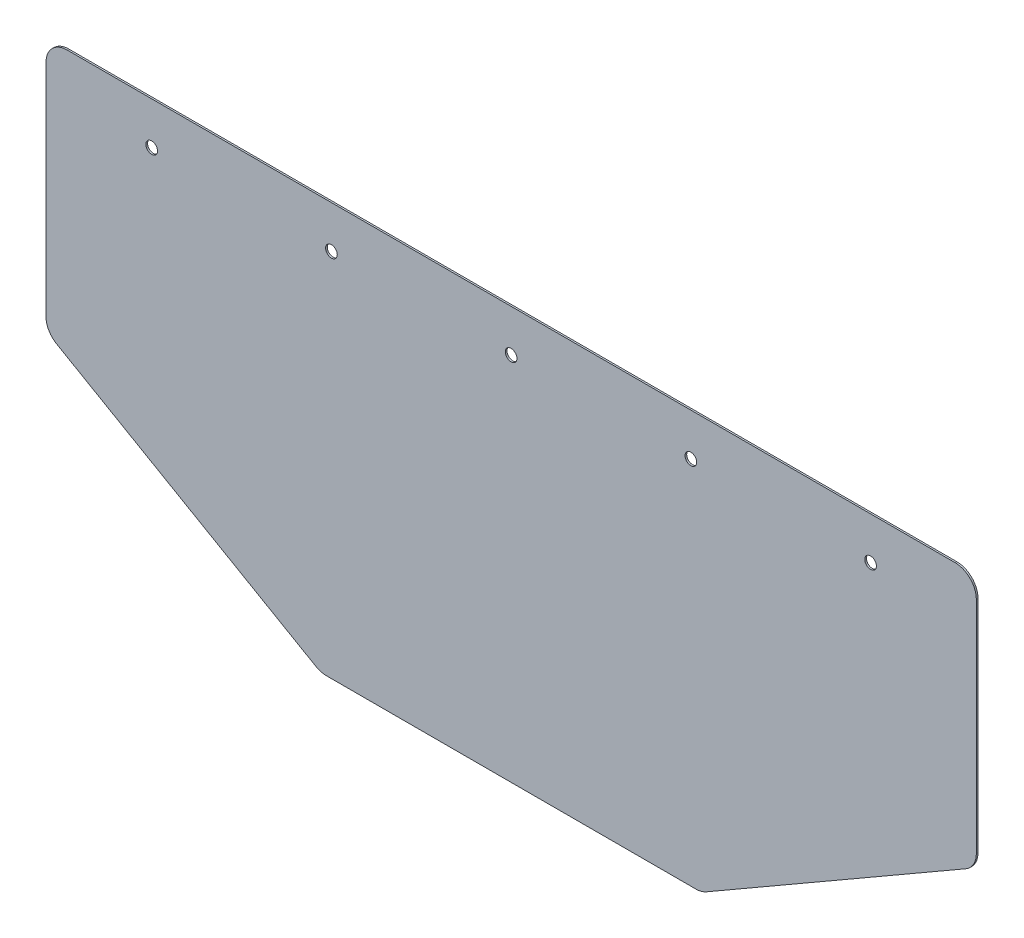
ISO-10303-21;
HEADER;
FILE_DESCRIPTION(('STEP AP214'),'2;1');
FILE_NAME('part.step','',(''),(''),'','','');
FILE_SCHEMA(('AUTOMOTIVE_DESIGN { 1 0 10303 214 1 1 1 1 }'));
ENDSEC;
DATA;
#1=APPLICATION_CONTEXT('core data for automotive mechanical design processes');
#2=APPLICATION_PROTOCOL_DEFINITION('international standard','automotive_design',2000,#1);
#3=PRODUCT_CONTEXT('',#1,'mechanical');
#4=PRODUCT('Part','Part','',(#3));
#5=PRODUCT_RELATED_PRODUCT_CATEGORY('part','',(#4));
#6=PRODUCT_DEFINITION_FORMATION('','',#4);
#7=PRODUCT_DEFINITION_CONTEXT('part definition',#1,'design');
#8=PRODUCT_DEFINITION('design','',#6,#7);
#9=PRODUCT_DEFINITION_SHAPE('','',#8);
#10=(LENGTH_UNIT() NAMED_UNIT(*) SI_UNIT(.MILLI.,.METRE.));
#11=(NAMED_UNIT(*) PLANE_ANGLE_UNIT() SI_UNIT($,.RADIAN.));
#12=(NAMED_UNIT(*) SI_UNIT($,.STERADIAN.) SOLID_ANGLE_UNIT());
#13=UNCERTAINTY_MEASURE_WITH_UNIT(LENGTH_MEASURE(1.E-05),#10,'distance_accuracy_value','');
#14=(GEOMETRIC_REPRESENTATION_CONTEXT(3) GLOBAL_UNCERTAINTY_ASSIGNED_CONTEXT((#13)) GLOBAL_UNIT_ASSIGNED_CONTEXT((#10,
#11,#12)) REPRESENTATION_CONTEXT('',''));
#15=CARTESIAN_POINT('',(0.,0.,0.));
#16=DIRECTION('',(0.,0.,1.));
#17=DIRECTION('',(1.,0.,0.));
#18=AXIS2_PLACEMENT_3D('',#15,#16,#17);
#19=CARTESIAN_POINT('',(-260.479399237396,-29.5340725077158,1.016));
#20=DIRECTION('',(0.,0.,1.));
#21=DIRECTION('',(1.,0.,0.));
#22=AXIS2_PLACEMENT_3D('',#19,#20,#21);
#23=PLANE('',#22);
#24=CARTESIAN_POINT('',(114.170600762604,90.1308656498606,1.016));
#25=DIRECTION('',(0.,0.,1.));
#26=DIRECTION('',(1.,0.,0.));
#27=AXIS2_PLACEMENT_3D('',#24,#25,#26);
#28=CIRCLE('',#27,3.50000000000001);
#29=CARTESIAN_POINT('',(117.670600762604,90.1308656498606,1.016));
#30=VERTEX_POINT('',#29);
#31=EDGE_CURVE('E455',#30,#30,#28,.T.);
#32=ORIENTED_EDGE('',*,*,#31,.F.);
#33=EDGE_LOOP('',(#32));
#34=FACE_BOUND('',#33,.T.);
#35=CARTESIAN_POINT('',(-101.729399237396,90.1308656498606,1.016));
#36=DIRECTION('',(0.,0.,1.));
#37=DIRECTION('',(1.,0.,0.));
#38=AXIS2_PLACEMENT_3D('',#35,#36,#37);
#39=CIRCLE('',#38,3.50000000000001);
#40=CARTESIAN_POINT('',(-98.2293992373955,90.1308656498606,1.016));
#41=VERTEX_POINT('',#40);
#42=EDGE_CURVE('E467',#41,#41,#39,.T.);
#43=ORIENTED_EDGE('',*,*,#42,.F.);
#44=EDGE_LOOP('',(#43));
#45=FACE_BOUND('',#44,.T.);
#46=DIRECTION('',(0.,1.,0.));
#47=VECTOR('',#46,1.);
#48=CARTESIAN_POINT('',(285.620600762604,115.530865649861,1.016));
#49=LINE('',#48,#47);
#50=CARTESIAN_POINT('',(285.620600762604,-29.5340725077158,1.016));
#51=VERTEX_POINT('',#50);
#52=CARTESIAN_POINT('',(285.620600762604,102.830865649861,1.016));
#53=VERTEX_POINT('',#52);
#54=EDGE_CURVE('E177',#51,#53,#49,.T.);
#55=ORIENTED_EDGE('',*,*,#54,.T.);
#56=CARTESIAN_POINT('',(272.920600762604,102.830865649861,1.016));
#57=DIRECTION('',(0.,0.,1.));
#58=DIRECTION('',(1.,0.,0.));
#59=AXIS2_PLACEMENT_3D('',#56,#57,#58);
#60=CIRCLE('',#59,12.7);
#61=CARTESIAN_POINT('',(272.920600762604,115.530865649861,1.016));
#62=VERTEX_POINT('',#61);
#63=EDGE_CURVE('E47',#53,#62,#60,.T.);
#64=ORIENTED_EDGE('',*,*,#63,.T.);
#65=DIRECTION('',(-1.,0.,0.));
#66=VECTOR('',#65,1.);
#67=CARTESIAN_POINT('',(285.620600762604,115.530865649861,1.016));
#68=LINE('',#67,#66);
#69=CARTESIAN_POINT('',(-260.479399237396,115.530865649861,1.016));
#70=VERTEX_POINT('',#69);
#71=EDGE_CURVE('E176',#62,#70,#68,.T.);
#72=ORIENTED_EDGE('',*,*,#71,.T.);
#73=CARTESIAN_POINT('',(-260.479399237396,102.830865649861,1.016));
#74=DIRECTION('',(0.,0.,1.));
#75=DIRECTION('',(1.,0.,0.));
#76=AXIS2_PLACEMENT_3D('',#73,#74,#75);
#77=CIRCLE('',#76,12.7);
#78=CARTESIAN_POINT('',(-273.179399237396,102.830865649861,1.016));
#79=VERTEX_POINT('',#78);
#80=EDGE_CURVE('E54',#70,#79,#77,.T.);
#81=ORIENTED_EDGE('',*,*,#80,.T.);
#82=DIRECTION('',(0.,-1.,0.));
#83=VECTOR('',#82,1.);
#84=CARTESIAN_POINT('',(-273.179399237396,115.530865649861,1.016));
#85=LINE('',#84,#83);
#86=CARTESIAN_POINT('',(-273.179399237396,-29.5340725077158,1.016));
#87=VERTEX_POINT('',#86);
#88=EDGE_CURVE('E132',#79,#87,#85,.T.);
#89=ORIENTED_EDGE('',*,*,#88,.T.);
#90=CARTESIAN_POINT('',(-260.479399237396,-29.5340725077158,1.016));
#91=DIRECTION('',(0.,0.,1.));
#92=DIRECTION('',(1.,0.,0.));
#93=AXIS2_PLACEMENT_3D('',#90,#91,#92);
#94=CIRCLE('',#93,12.7);
#95=CARTESIAN_POINT('',(-266.825874396713,-40.534629450533,1.016));
#96=VERTEX_POINT('',#95);
#97=EDGE_CURVE('E135',#87,#96,#94,.T.);
#98=ORIENTED_EDGE('',*,*,#97,.T.);
#99=DIRECTION('',(0.866185586048601,-0.499722453489577,0.));
#100=VECTOR('',#99,1.);
#101=CARTESIAN_POINT('',(-266.825874396713,-40.534629450533,1.016));
#102=LINE('',#101,#100);
#103=CARTESIAN_POINT('',(-111.025100536512,-130.419691292956,1.016));
#104=VERTEX_POINT('',#103);
#105=EDGE_CURVE('E149',#96,#104,#102,.T.);
#106=ORIENTED_EDGE('',*,*,#105,.T.);
#107=CARTESIAN_POINT('',(-104.678625377195,-119.419134350139,1.016));
#108=DIRECTION('',(0.,0.,1.));
#109=DIRECTION('',(-1.,0.,0.));
#110=AXIS2_PLACEMENT_3D('',#107,#108,#109);
#111=CIRCLE('',#110,12.7);
#112=CARTESIAN_POINT('',(-104.678625377195,-132.119134350139,1.016));
#113=VERTEX_POINT('',#112);
#114=EDGE_CURVE('E229',#104,#113,#111,.T.);
#115=ORIENTED_EDGE('',*,*,#114,.T.);
#116=DIRECTION('',(1.,0.,0.));
#117=VECTOR('',#116,1.);
#118=CARTESIAN_POINT('',(6.2206007626045,-132.119134350139,1.016));
#119=LINE('',#118,#117);
#120=CARTESIAN_POINT('',(117.119826902404,-132.119134350139,1.016));
#121=VERTEX_POINT('',#120);
#122=EDGE_CURVE('E263',#113,#121,#119,.T.);
#123=ORIENTED_EDGE('',*,*,#122,.T.);
#124=CARTESIAN_POINT('',(117.119826902404,-119.419134350139,1.016));
#125=DIRECTION('',(0.,0.,1.));
#126=DIRECTION('',(-1.,0.,0.));
#127=AXIS2_PLACEMENT_3D('',#124,#125,#126);
#128=CIRCLE('',#127,12.7);
#129=CARTESIAN_POINT('',(123.466302061721,-130.419691292957,1.016));
#130=VERTEX_POINT('',#129);
#131=EDGE_CURVE('E256',#121,#130,#128,.T.);
#132=ORIENTED_EDGE('',*,*,#131,.T.);
#133=DIRECTION('',(0.866185586048601,0.499722453489577,0.));
#134=VECTOR('',#133,1.);
#135=CARTESIAN_POINT('',(279.267075921922,-40.534629450533,1.016));
#136=LINE('',#135,#134);
#137=CARTESIAN_POINT('',(279.267075921922,-40.5346294505329,1.016));
#138=VERTEX_POINT('',#137);
#139=EDGE_CURVE('E252',#130,#138,#136,.T.);
#140=ORIENTED_EDGE('',*,*,#139,.T.);
#141=CARTESIAN_POINT('',(272.920600762604,-29.5340725077158,1.016));
#142=DIRECTION('',(0.,0.,1.));
#143=DIRECTION('',(-1.,0.,0.));
#144=AXIS2_PLACEMENT_3D('',#141,#142,#143);
#145=CIRCLE('',#144,12.7);
#146=EDGE_CURVE('E251',#138,#51,#145,.T.);
#147=ORIENTED_EDGE('',*,*,#146,.T.);
#148=EDGE_LOOP('',(#55,#64,#72,#81,#89,#98,#106,#115,#123,#132,#140,#147));
#149=FACE_BOUND('',#148,.T.);
#150=CARTESIAN_POINT('',(-209.679399237396,90.1308656498606,1.016));
#151=DIRECTION('',(0.,0.,1.));
#152=DIRECTION('',(1.,0.,0.));
#153=AXIS2_PLACEMENT_3D('',#150,#151,#152);
#154=CIRCLE('',#153,3.49999999999999);
#155=CARTESIAN_POINT('',(-206.179399237396,90.1308656498606,1.016));
#156=VERTEX_POINT('',#155);
#157=EDGE_CURVE('E260',#156,#156,#154,.T.);
#158=ORIENTED_EDGE('',*,*,#157,.F.);
#159=EDGE_LOOP('',(#158));
#160=FACE_BOUND('',#159,.T.);
#161=CARTESIAN_POINT('',(6.2206007626045,90.1308656498606,1.016));
#162=DIRECTION('',(0.,0.,1.));
#163=DIRECTION('',(1.,0.,0.));
#164=AXIS2_PLACEMENT_3D('',#161,#162,#163);
#165=CIRCLE('',#164,3.5);
#166=CARTESIAN_POINT('',(9.7206007626045,90.1308656498606,1.016));
#167=VERTEX_POINT('',#166);
#168=EDGE_CURVE('E461',#167,#167,#165,.T.);
#169=ORIENTED_EDGE('',*,*,#168,.F.);
#170=EDGE_LOOP('',(#169));
#171=FACE_BOUND('',#170,.T.);
#172=CARTESIAN_POINT('',(222.120600762604,90.1308656498606,1.016));
#173=DIRECTION('',(0.,0.,1.));
#174=DIRECTION('',(1.,0.,0.));
#175=AXIS2_PLACEMENT_3D('',#172,#173,#174);
#176=CIRCLE('',#175,3.49999999999999);
#177=CARTESIAN_POINT('',(225.620600762604,90.1308656498606,1.016));
#178=VERTEX_POINT('',#177);
#179=EDGE_CURVE('E445',#178,#178,#176,.T.);
#180=ORIENTED_EDGE('',*,*,#179,.F.);
#181=EDGE_LOOP('',(#180));
#182=FACE_BOUND('',#181,.T.);
#183=ADVANCED_FACE('F39',(#34,#45,#149,#160,#171,#182),#23,.T.);
#184=CARTESIAN_POINT('',(-260.479399237396,-29.5340725077158,0.));
#185=DIRECTION('',(0.,0.,1.));
#186=DIRECTION('',(1.,0.,0.));
#187=AXIS2_PLACEMENT_3D('',#184,#185,#186);
#188=PLANE('',#187);
#189=DIRECTION('',(-1.,0.,0.));
#190=VECTOR('',#189,1.);
#191=CARTESIAN_POINT('',(285.620600762604,115.530865649861,0.));
#192=LINE('',#191,#190);
#193=CARTESIAN_POINT('',(272.920600762604,115.530865649861,0.));
#194=VERTEX_POINT('',#193);
#195=CARTESIAN_POINT('',(-260.479399237396,115.530865649861,0.));
#196=VERTEX_POINT('',#195);
#197=EDGE_CURVE('E140',#194,#196,#192,.T.);
#198=ORIENTED_EDGE('',*,*,#197,.F.);
#199=CARTESIAN_POINT('',(272.920600762604,102.830865649861,0.));
#200=DIRECTION('',(0.,0.,1.));
#201=DIRECTION('',(1.,0.,0.));
#202=AXIS2_PLACEMENT_3D('',#199,#200,#201);
#203=CIRCLE('',#202,12.7);
#204=CARTESIAN_POINT('',(285.620600762604,102.830865649861,0.));
#205=VERTEX_POINT('',#204);
#206=EDGE_CURVE('E168',#194,#205,#203,.F.);
#207=ORIENTED_EDGE('',*,*,#206,.T.);
#208=DIRECTION('',(0.,1.,0.));
#209=VECTOR('',#208,1.);
#210=CARTESIAN_POINT('',(285.620600762604,115.530865649861,0.));
#211=LINE('',#210,#209);
#212=CARTESIAN_POINT('',(285.620600762604,-29.5340725077158,0.));
#213=VERTEX_POINT('',#212);
#214=EDGE_CURVE('E194',#213,#205,#211,.T.);
#215=ORIENTED_EDGE('',*,*,#214,.F.);
#216=CARTESIAN_POINT('',(272.920600762604,-29.5340725077158,0.));
#217=DIRECTION('',(0.,0.,1.));
#218=DIRECTION('',(-1.,0.,0.));
#219=AXIS2_PLACEMENT_3D('',#216,#217,#218);
#220=CIRCLE('',#219,12.7);
#221=CARTESIAN_POINT('',(279.267075921922,-40.5346294505329,0.));
#222=VERTEX_POINT('',#221);
#223=EDGE_CURVE('E199',#222,#213,#220,.T.);
#224=ORIENTED_EDGE('',*,*,#223,.F.);
#225=DIRECTION('',(0.866185586048601,0.499722453489577,0.));
#226=VECTOR('',#225,1.);
#227=CARTESIAN_POINT('',(279.267075921922,-40.534629450533,0.));
#228=LINE('',#227,#226);
#229=CARTESIAN_POINT('',(123.466302061721,-130.419691292957,0.));
#230=VERTEX_POINT('',#229);
#231=EDGE_CURVE('E204',#230,#222,#228,.T.);
#232=ORIENTED_EDGE('',*,*,#231,.F.);
#233=CARTESIAN_POINT('',(117.119826902404,-119.419134350139,0.));
#234=DIRECTION('',(0.,0.,1.));
#235=DIRECTION('',(-1.,0.,0.));
#236=AXIS2_PLACEMENT_3D('',#233,#234,#235);
#237=CIRCLE('',#236,12.7);
#238=CARTESIAN_POINT('',(117.119826902404,-132.119134350139,0.));
#239=VERTEX_POINT('',#238);
#240=EDGE_CURVE('E236',#239,#230,#237,.T.);
#241=ORIENTED_EDGE('',*,*,#240,.F.);
#242=DIRECTION('',(1.,0.,0.));
#243=VECTOR('',#242,1.);
#244=CARTESIAN_POINT('',(6.2206007626045,-132.119134350139,0.));
#245=LINE('',#244,#243);
#246=CARTESIAN_POINT('',(-104.678625377195,-132.119134350139,0.));
#247=VERTEX_POINT('',#246);
#248=EDGE_CURVE('E234',#247,#239,#245,.T.);
#249=ORIENTED_EDGE('',*,*,#248,.F.);
#250=CARTESIAN_POINT('',(-104.678625377195,-119.419134350139,0.));
#251=DIRECTION('',(0.,0.,1.));
#252=DIRECTION('',(-1.,0.,0.));
#253=AXIS2_PLACEMENT_3D('',#250,#251,#252);
#254=CIRCLE('',#253,12.7);
#255=CARTESIAN_POINT('',(-111.025100536512,-130.419691292956,0.));
#256=VERTEX_POINT('',#255);
#257=EDGE_CURVE('E228',#256,#247,#254,.T.);
#258=ORIENTED_EDGE('',*,*,#257,.F.);
#259=DIRECTION('',(0.866185586048601,-0.499722453489577,0.));
#260=VECTOR('',#259,1.);
#261=CARTESIAN_POINT('',(-266.825874396713,-40.534629450533,0.));
#262=LINE('',#261,#260);
#263=CARTESIAN_POINT('',(-266.825874396713,-40.534629450533,0.));
#264=VERTEX_POINT('',#263);
#265=EDGE_CURVE('E232',#264,#256,#262,.T.);
#266=ORIENTED_EDGE('',*,*,#265,.F.);
#267=CARTESIAN_POINT('',(-260.479399237396,-29.5340725077158,0.));
#268=DIRECTION('',(0.,0.,1.));
#269=DIRECTION('',(1.,0.,0.));
#270=AXIS2_PLACEMENT_3D('',#267,#268,#269);
#271=CIRCLE('',#270,12.7);
#272=CARTESIAN_POINT('',(-273.179399237396,-29.5340725077158,0.));
#273=VERTEX_POINT('',#272);
#274=EDGE_CURVE('E238',#273,#264,#271,.T.);
#275=ORIENTED_EDGE('',*,*,#274,.F.);
#276=DIRECTION('',(0.,-1.,0.));
#277=VECTOR('',#276,1.);
#278=CARTESIAN_POINT('',(-273.179399237396,115.530865649861,0.));
#279=LINE('',#278,#277);
#280=CARTESIAN_POINT('',(-273.179399237396,102.830865649861,0.));
#281=VERTEX_POINT('',#280);
#282=EDGE_CURVE('E153',#281,#273,#279,.T.);
#283=ORIENTED_EDGE('',*,*,#282,.F.);
#284=CARTESIAN_POINT('',(-260.479399237396,102.830865649861,0.));
#285=DIRECTION('',(0.,0.,1.));
#286=DIRECTION('',(1.,0.,0.));
#287=AXIS2_PLACEMENT_3D('',#284,#285,#286);
#288=CIRCLE('',#287,12.7);
#289=EDGE_CURVE('E166',#281,#196,#288,.F.);
#290=ORIENTED_EDGE('',*,*,#289,.T.);
#291=EDGE_LOOP('',(#198,#207,#215,#224,#232,#241,#249,#258,#266,#275,#283,#290));
#292=FACE_BOUND('',#291,.T.);
#293=CARTESIAN_POINT('',(-209.679399237396,90.1308656498606,0.));
#294=DIRECTION('',(0.,0.,1.));
#295=DIRECTION('',(1.,0.,0.));
#296=AXIS2_PLACEMENT_3D('',#293,#294,#295);
#297=CIRCLE('',#296,3.49999999999999);
#298=CARTESIAN_POINT('',(-206.179399237396,90.1308656498606,0.));
#299=VERTEX_POINT('',#298);
#300=EDGE_CURVE('E470',#299,#299,#297,.T.);
#301=ORIENTED_EDGE('',*,*,#300,.T.);
#302=EDGE_LOOP('',(#301));
#303=FACE_BOUND('',#302,.T.);
#304=CARTESIAN_POINT('',(-101.729399237396,90.1308656498606,0.));
#305=DIRECTION('',(0.,0.,1.));
#306=DIRECTION('',(1.,0.,0.));
#307=AXIS2_PLACEMENT_3D('',#304,#305,#306);
#308=CIRCLE('',#307,3.50000000000001);
#309=CARTESIAN_POINT('',(-98.2293992373955,90.1308656498606,0.));
#310=VERTEX_POINT('',#309);
#311=EDGE_CURVE('E464',#310,#310,#308,.T.);
#312=ORIENTED_EDGE('',*,*,#311,.T.);
#313=EDGE_LOOP('',(#312));
#314=FACE_BOUND('',#313,.T.);
#315=CARTESIAN_POINT('',(6.2206007626045,90.1308656498606,0.));
#316=DIRECTION('',(0.,0.,1.));
#317=DIRECTION('',(1.,0.,0.));
#318=AXIS2_PLACEMENT_3D('',#315,#316,#317);
#319=CIRCLE('',#318,3.5);
#320=CARTESIAN_POINT('',(9.7206007626045,90.1308656498606,0.));
#321=VERTEX_POINT('',#320);
#322=EDGE_CURVE('E458',#321,#321,#319,.T.);
#323=ORIENTED_EDGE('',*,*,#322,.T.);
#324=EDGE_LOOP('',(#323));
#325=FACE_BOUND('',#324,.T.);
#326=CARTESIAN_POINT('',(114.170600762604,90.1308656498606,0.));
#327=DIRECTION('',(0.,0.,1.));
#328=DIRECTION('',(1.,0.,0.));
#329=AXIS2_PLACEMENT_3D('',#326,#327,#328);
#330=CIRCLE('',#329,3.50000000000001);
#331=CARTESIAN_POINT('',(117.670600762604,90.1308656498606,0.));
#332=VERTEX_POINT('',#331);
#333=EDGE_CURVE('E452',#332,#332,#330,.T.);
#334=ORIENTED_EDGE('',*,*,#333,.T.);
#335=EDGE_LOOP('',(#334));
#336=FACE_BOUND('',#335,.T.);
#337=CARTESIAN_POINT('',(222.120600762604,90.1308656498606,0.));
#338=DIRECTION('',(0.,0.,1.));
#339=DIRECTION('',(1.,0.,0.));
#340=AXIS2_PLACEMENT_3D('',#337,#338,#339);
#341=CIRCLE('',#340,3.49999999999999);
#342=CARTESIAN_POINT('',(225.620600762604,90.1308656498606,0.));
#343=VERTEX_POINT('',#342);
#344=EDGE_CURVE('E448',#343,#343,#341,.T.);
#345=ORIENTED_EDGE('',*,*,#344,.T.);
#346=EDGE_LOOP('',(#345));
#347=FACE_BOUND('',#346,.T.);
#348=ADVANCED_FACE('F191',(#292,#303,#314,#325,#336,#347),#188,.F.);
#349=CARTESIAN_POINT('',(-273.179399237396,115.530865649861,1.016));
#350=DIRECTION('',(1.,0.,0.));
#351=DIRECTION('',(0.,0.,-1.));
#352=AXIS2_PLACEMENT_3D('',#349,#350,#351);
#353=PLANE('',#352);
#354=ORIENTED_EDGE('',*,*,#88,.F.);
#355=DIRECTION('',(0.,0.,-1.));
#356=VECTOR('',#355,1.);
#357=CARTESIAN_POINT('',(-273.179399237396,102.830865649861,1.016));
#358=LINE('',#357,#356);
#359=EDGE_CURVE('E11',#79,#281,#358,.T.);
#360=ORIENTED_EDGE('',*,*,#359,.T.);
#361=ORIENTED_EDGE('',*,*,#282,.T.);
#362=DIRECTION('',(0.,0.,-1.));
#363=VECTOR('',#362,1.);
#364=CARTESIAN_POINT('',(-273.179399237396,-29.5340725077158,1.016));
#365=LINE('',#364,#363);
#366=EDGE_CURVE('E145',#87,#273,#365,.T.);
#367=ORIENTED_EDGE('',*,*,#366,.F.);
#368=EDGE_LOOP('',(#354,#360,#361,#367));
#369=FACE_BOUND('',#368,.T.);
#370=ADVANCED_FACE('F151',(#369),#353,.F.);
#371=CARTESIAN_POINT('',(-260.479399237396,-29.5340725077158,1.016));
#372=DIRECTION('',(0.,0.,-1.));
#373=DIRECTION('',(-1.,0.,0.));
#374=AXIS2_PLACEMENT_3D('',#371,#372,#373);
#375=CYLINDRICAL_SURFACE('',#374,12.7);
#376=ORIENTED_EDGE('',*,*,#274,.T.);
#377=DIRECTION('',(0.,0.,-1.));
#378=VECTOR('',#377,1.);
#379=CARTESIAN_POINT('',(-266.825874396713,-40.534629450533,1.016));
#380=LINE('',#379,#378);
#381=EDGE_CURVE('E147',#96,#264,#380,.T.);
#382=ORIENTED_EDGE('',*,*,#381,.F.);
#383=ORIENTED_EDGE('',*,*,#97,.F.);
#384=ORIENTED_EDGE('',*,*,#366,.T.);
#385=EDGE_LOOP('',(#376,#382,#383,#384));
#386=FACE_BOUND('',#385,.T.);
#387=ADVANCED_FACE('F144',(#386),#375,.T.);
#388=CARTESIAN_POINT('',(-266.825874396713,-40.534629450533,1.016));
#389=DIRECTION('',(0.499722453489577,0.866185586048601,0.));
#390=DIRECTION('',(-0.866185586048601,0.499722453489577,0.));
#391=AXIS2_PLACEMENT_3D('',#388,#389,#390);
#392=PLANE('',#391);
#393=ORIENTED_EDGE('',*,*,#265,.T.);
#394=DIRECTION('',(0.,0.,-1.));
#395=VECTOR('',#394,1.);
#396=CARTESIAN_POINT('',(-111.025100536512,-130.419691292956,1.016));
#397=LINE('',#396,#395);
#398=EDGE_CURVE('E159',#104,#256,#397,.T.);
#399=ORIENTED_EDGE('',*,*,#398,.F.);
#400=ORIENTED_EDGE('',*,*,#105,.F.);
#401=ORIENTED_EDGE('',*,*,#381,.T.);
#402=EDGE_LOOP('',(#393,#399,#400,#401));
#403=FACE_BOUND('',#402,.T.);
#404=ADVANCED_FACE('F261',(#403),#392,.F.);
#405=CARTESIAN_POINT('',(-104.678625377195,-119.419134350139,1.016));
#406=DIRECTION('',(0.,0.,-1.));
#407=DIRECTION('',(-1.,0.,0.));
#408=AXIS2_PLACEMENT_3D('',#405,#406,#407);
#409=CYLINDRICAL_SURFACE('',#408,12.7);
#410=ORIENTED_EDGE('',*,*,#257,.T.);
#411=DIRECTION('',(0.,0.,-1.));
#412=VECTOR('',#411,1.);
#413=CARTESIAN_POINT('',(-104.678625377195,-132.119134350139,1.016));
#414=LINE('',#413,#412);
#415=EDGE_CURVE('E218',#113,#247,#414,.T.);
#416=ORIENTED_EDGE('',*,*,#415,.F.);
#417=ORIENTED_EDGE('',*,*,#114,.F.);
#418=ORIENTED_EDGE('',*,*,#398,.T.);
#419=EDGE_LOOP('',(#410,#416,#417,#418));
#420=FACE_BOUND('',#419,.T.);
#421=ADVANCED_FACE('F226',(#420),#409,.T.);
#422=CARTESIAN_POINT('',(6.2206007626045,-132.119134350139,1.016));
#423=DIRECTION('',(0.,1.,0.));
#424=DIRECTION('',(-1.,0.,0.));
#425=AXIS2_PLACEMENT_3D('',#422,#423,#424);
#426=PLANE('',#425);
#427=ORIENTED_EDGE('',*,*,#248,.T.);
#428=DIRECTION('',(0.,0.,-1.));
#429=VECTOR('',#428,1.);
#430=CARTESIAN_POINT('',(117.119826902404,-132.119134350139,1.016));
#431=LINE('',#430,#429);
#432=EDGE_CURVE('E215',#121,#239,#431,.T.);
#433=ORIENTED_EDGE('',*,*,#432,.F.);
#434=ORIENTED_EDGE('',*,*,#122,.F.);
#435=ORIENTED_EDGE('',*,*,#415,.T.);
#436=EDGE_LOOP('',(#427,#433,#434,#435));
#437=FACE_BOUND('',#436,.T.);
#438=ADVANCED_FACE('F272',(#437),#426,.F.);
#439=CARTESIAN_POINT('',(117.119826902404,-119.419134350139,1.016));
#440=DIRECTION('',(0.,0.,-1.));
#441=DIRECTION('',(-1.,0.,0.));
#442=AXIS2_PLACEMENT_3D('',#439,#440,#441);
#443=CYLINDRICAL_SURFACE('',#442,12.7);
#444=ORIENTED_EDGE('',*,*,#240,.T.);
#445=DIRECTION('',(0.,0.,-1.));
#446=VECTOR('',#445,1.);
#447=CARTESIAN_POINT('',(123.466302061721,-130.419691292957,1.016));
#448=LINE('',#447,#446);
#449=EDGE_CURVE('E212',#130,#230,#448,.T.);
#450=ORIENTED_EDGE('',*,*,#449,.F.);
#451=ORIENTED_EDGE('',*,*,#131,.F.);
#452=ORIENTED_EDGE('',*,*,#432,.T.);
#453=EDGE_LOOP('',(#444,#450,#451,#452));
#454=FACE_BOUND('',#453,.T.);
#455=ADVANCED_FACE('F270',(#454),#443,.T.);
#456=CARTESIAN_POINT('',(279.267075921922,-40.534629450533,1.016));
#457=DIRECTION('',(-0.499722453489577,0.866185586048601,0.));
#458=DIRECTION('',(-0.866185586048601,-0.499722453489577,0.));
#459=AXIS2_PLACEMENT_3D('',#456,#457,#458);
#460=PLANE('',#459);
#461=ORIENTED_EDGE('',*,*,#231,.T.);
#462=DIRECTION('',(0.,0.,-1.));
#463=VECTOR('',#462,1.);
#464=CARTESIAN_POINT('',(279.267075921922,-40.5346294505329,1.016));
#465=LINE('',#464,#463);
#466=EDGE_CURVE('E209',#138,#222,#465,.T.);
#467=ORIENTED_EDGE('',*,*,#466,.F.);
#468=ORIENTED_EDGE('',*,*,#139,.F.);
#469=ORIENTED_EDGE('',*,*,#449,.T.);
#470=EDGE_LOOP('',(#461,#467,#468,#469));
#471=FACE_BOUND('',#470,.T.);
#472=ADVANCED_FACE('F245',(#471),#460,.F.);
#473=CARTESIAN_POINT('',(272.920600762604,-29.5340725077158,1.016));
#474=DIRECTION('',(0.,0.,-1.));
#475=DIRECTION('',(-1.,0.,0.));
#476=AXIS2_PLACEMENT_3D('',#473,#474,#475);
#477=CYLINDRICAL_SURFACE('',#476,12.7);
#478=ORIENTED_EDGE('',*,*,#223,.T.);
#479=DIRECTION('',(0.,0.,-1.));
#480=VECTOR('',#479,1.);
#481=CARTESIAN_POINT('',(285.620600762604,-29.5340725077158,1.016));
#482=LINE('',#481,#480);
#483=EDGE_CURVE('E186',#51,#213,#482,.T.);
#484=ORIENTED_EDGE('',*,*,#483,.F.);
#485=ORIENTED_EDGE('',*,*,#146,.F.);
#486=ORIENTED_EDGE('',*,*,#466,.T.);
#487=EDGE_LOOP('',(#478,#484,#485,#486));
#488=FACE_BOUND('',#487,.T.);
#489=ADVANCED_FACE('F250',(#488),#477,.T.);
#490=CARTESIAN_POINT('',(285.620600762604,115.530865649861,1.016));
#491=DIRECTION('',(-1.,0.,0.));
#492=DIRECTION('',(0.,0.,1.));
#493=AXIS2_PLACEMENT_3D('',#490,#491,#492);
#494=PLANE('',#493);
#495=ORIENTED_EDGE('',*,*,#214,.T.);
#496=DIRECTION('',(0.,0.,-1.));
#497=VECTOR('',#496,1.);
#498=CARTESIAN_POINT('',(285.620600762604,102.830865649861,1.016));
#499=LINE('',#498,#497);
#500=EDGE_CURVE('E65',#205,#53,#499,.F.);
#501=ORIENTED_EDGE('',*,*,#500,.T.);
#502=ORIENTED_EDGE('',*,*,#54,.F.);
#503=ORIENTED_EDGE('',*,*,#483,.T.);
#504=EDGE_LOOP('',(#495,#501,#502,#503));
#505=FACE_BOUND('',#504,.T.);
#506=ADVANCED_FACE('F196',(#505),#494,.F.);
#507=CARTESIAN_POINT('',(285.620600762604,115.530865649861,1.016));
#508=DIRECTION('',(0.,-1.,0.));
#509=DIRECTION('',(1.,0.,0.));
#510=AXIS2_PLACEMENT_3D('',#507,#508,#509);
#511=PLANE('',#510);
#512=ORIENTED_EDGE('',*,*,#71,.F.);
#513=DIRECTION('',(0.,0.,-1.));
#514=VECTOR('',#513,1.);
#515=CARTESIAN_POINT('',(272.920600762604,115.530865649861,1.016));
#516=LINE('',#515,#514);
#517=EDGE_CURVE('E157',#62,#194,#516,.T.);
#518=ORIENTED_EDGE('',*,*,#517,.T.);
#519=ORIENTED_EDGE('',*,*,#197,.T.);
#520=DIRECTION('',(0.,0.,-1.));
#521=VECTOR('',#520,1.);
#522=CARTESIAN_POINT('',(-260.479399237396,115.530865649861,1.016));
#523=LINE('',#522,#521);
#524=EDGE_CURVE('E155',#196,#70,#523,.F.);
#525=ORIENTED_EDGE('',*,*,#524,.T.);
#526=EDGE_LOOP('',(#512,#518,#519,#525));
#527=FACE_BOUND('',#526,.T.);
#528=ADVANCED_FACE('F181',(#527),#511,.F.);
#529=CARTESIAN_POINT('',(-209.679399237396,90.1308656498606,1.016));
#530=DIRECTION('',(0.,0.,-1.));
#531=DIRECTION('',(-1.,0.,0.));
#532=AXIS2_PLACEMENT_3D('',#529,#530,#531);
#533=CYLINDRICAL_SURFACE('',#532,3.49999999999999);
#534=ORIENTED_EDGE('',*,*,#157,.T.);
#535=EDGE_LOOP('',(#534));
#536=FACE_BOUND('',#535,.T.);
#537=ORIENTED_EDGE('',*,*,#300,.F.);
#538=EDGE_LOOP('',(#537));
#539=FACE_BOUND('',#538,.T.);
#540=ADVANCED_FACE('F291',(#536,#539),#533,.F.);
#541=CARTESIAN_POINT('',(-101.729399237396,90.1308656498606,1.016));
#542=DIRECTION('',(0.,0.,-1.));
#543=DIRECTION('',(-1.,0.,0.));
#544=AXIS2_PLACEMENT_3D('',#541,#542,#543);
#545=CYLINDRICAL_SURFACE('',#544,3.50000000000001);
#546=ORIENTED_EDGE('',*,*,#42,.T.);
#547=EDGE_LOOP('',(#546));
#548=FACE_BOUND('',#547,.T.);
#549=ORIENTED_EDGE('',*,*,#311,.F.);
#550=EDGE_LOOP('',(#549));
#551=FACE_BOUND('',#550,.T.);
#552=ADVANCED_FACE('F325',(#548,#551),#545,.F.);
#553=CARTESIAN_POINT('',(6.2206007626045,90.1308656498606,1.016));
#554=DIRECTION('',(0.,0.,-1.));
#555=DIRECTION('',(-1.,0.,0.));
#556=AXIS2_PLACEMENT_3D('',#553,#554,#555);
#557=CYLINDRICAL_SURFACE('',#556,3.5);
#558=ORIENTED_EDGE('',*,*,#168,.T.);
#559=EDGE_LOOP('',(#558));
#560=FACE_BOUND('',#559,.T.);
#561=ORIENTED_EDGE('',*,*,#322,.F.);
#562=EDGE_LOOP('',(#561));
#563=FACE_BOUND('',#562,.T.);
#564=ADVANCED_FACE('F332',(#560,#563),#557,.F.);
#565=CARTESIAN_POINT('',(114.170600762604,90.1308656498606,1.016));
#566=DIRECTION('',(0.,0.,-1.));
#567=DIRECTION('',(-1.,0.,0.));
#568=AXIS2_PLACEMENT_3D('',#565,#566,#567);
#569=CYLINDRICAL_SURFACE('',#568,3.50000000000001);
#570=ORIENTED_EDGE('',*,*,#31,.T.);
#571=EDGE_LOOP('',(#570));
#572=FACE_BOUND('',#571,.T.);
#573=ORIENTED_EDGE('',*,*,#333,.F.);
#574=EDGE_LOOP('',(#573));
#575=FACE_BOUND('',#574,.T.);
#576=ADVANCED_FACE('F339',(#572,#575),#569,.F.);
#577=CARTESIAN_POINT('',(222.120600762604,90.1308656498606,1.016));
#578=DIRECTION('',(0.,0.,-1.));
#579=DIRECTION('',(-1.,0.,0.));
#580=AXIS2_PLACEMENT_3D('',#577,#578,#579);
#581=CYLINDRICAL_SURFACE('',#580,3.49999999999999);
#582=ORIENTED_EDGE('',*,*,#179,.T.);
#583=EDGE_LOOP('',(#582));
#584=FACE_BOUND('',#583,.T.);
#585=ORIENTED_EDGE('',*,*,#344,.F.);
#586=EDGE_LOOP('',(#585));
#587=FACE_BOUND('',#586,.T.);
#588=ADVANCED_FACE('F347',(#584,#587),#581,.F.);
#589=CARTESIAN_POINT('',(272.920600762604,102.830865649861,1.016));
#590=DIRECTION('',(0.,0.,-1.));
#591=DIRECTION('',(-1.,0.,0.));
#592=AXIS2_PLACEMENT_3D('',#589,#590,#591);
#593=CYLINDRICAL_SURFACE('',#592,12.7);
#594=ORIENTED_EDGE('',*,*,#63,.F.);
#595=ORIENTED_EDGE('',*,*,#500,.F.);
#596=ORIENTED_EDGE('',*,*,#206,.F.);
#597=ORIENTED_EDGE('',*,*,#517,.F.);
#598=EDGE_LOOP('',(#594,#595,#596,#597));
#599=FACE_BOUND('',#598,.T.);
#600=ADVANCED_FACE('F188',(#599),#593,.T.);
#601=CARTESIAN_POINT('',(-260.479399237396,102.830865649861,1.016));
#602=DIRECTION('',(0.,0.,-1.));
#603=DIRECTION('',(-1.,0.,0.));
#604=AXIS2_PLACEMENT_3D('',#601,#602,#603);
#605=CYLINDRICAL_SURFACE('',#604,12.7);
#606=ORIENTED_EDGE('',*,*,#80,.F.);
#607=ORIENTED_EDGE('',*,*,#524,.F.);
#608=ORIENTED_EDGE('',*,*,#289,.F.);
#609=ORIENTED_EDGE('',*,*,#359,.F.);
#610=EDGE_LOOP('',(#606,#607,#608,#609));
#611=FACE_BOUND('',#610,.T.);
#612=ADVANCED_FACE('F41',(#611),#605,.T.);
#613=CLOSED_SHELL('',(#183,#348,#370,#387,#404,#421,#438,#455,#472,#489,#506,#528,#540,#552,
#564,#576,#588,#600,#612));
#614=MANIFOLD_SOLID_BREP('B2',#613);
#615=ADVANCED_BREP_SHAPE_REPRESENTATION('',(#18,#614),#14);
#616=SHAPE_DEFINITION_REPRESENTATION(#9,#615);
ENDSEC;
END-ISO-10303-21;
